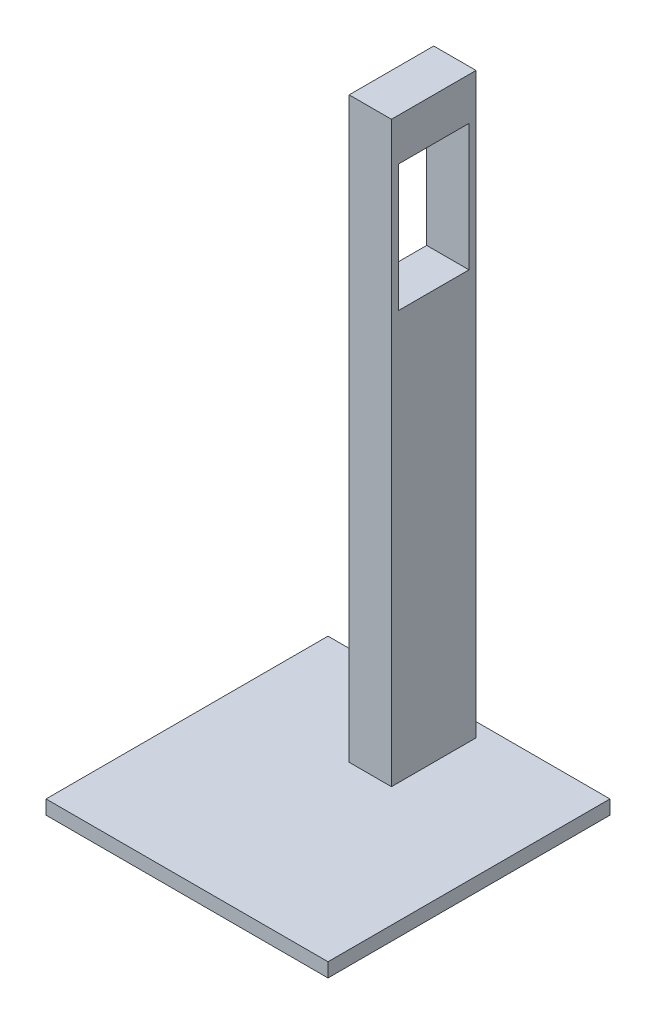
ISO-10303-21;
HEADER;
FILE_DESCRIPTION(('STEP AP214'),'2;1');
FILE_NAME('part.step','',(''),(''),'','','');
FILE_SCHEMA(('AUTOMOTIVE_DESIGN { 1 0 10303 214 1 1 1 1 }'));
ENDSEC;
DATA;
#1=APPLICATION_CONTEXT('core data for automotive mechanical design processes');
#2=APPLICATION_PROTOCOL_DEFINITION('international standard','automotive_design',2000,#1);
#3=PRODUCT_CONTEXT('',#1,'mechanical');
#4=PRODUCT('Part','Part','',(#3));
#5=PRODUCT_RELATED_PRODUCT_CATEGORY('part','',(#4));
#6=PRODUCT_DEFINITION_FORMATION('','',#4);
#7=PRODUCT_DEFINITION_CONTEXT('part definition',#1,'design');
#8=PRODUCT_DEFINITION('design','',#6,#7);
#9=PRODUCT_DEFINITION_SHAPE('','',#8);
#10=(LENGTH_UNIT() NAMED_UNIT(*) SI_UNIT(.MILLI.,.METRE.));
#11=(NAMED_UNIT(*) PLANE_ANGLE_UNIT() SI_UNIT($,.RADIAN.));
#12=(NAMED_UNIT(*) SI_UNIT($,.STERADIAN.) SOLID_ANGLE_UNIT());
#13=UNCERTAINTY_MEASURE_WITH_UNIT(LENGTH_MEASURE(1.E-05),#10,'distance_accuracy_value','');
#14=(GEOMETRIC_REPRESENTATION_CONTEXT(3) GLOBAL_UNCERTAINTY_ASSIGNED_CONTEXT((#13)) GLOBAL_UNIT_ASSIGNED_CONTEXT((#10,
#11,#12)) REPRESENTATION_CONTEXT('',''));
#15=CARTESIAN_POINT('',(0.,0.,0.));
#16=DIRECTION('',(0.,0.,1.));
#17=DIRECTION('',(1.,0.,0.));
#18=AXIS2_PLACEMENT_3D('',#15,#16,#17);
#19=CARTESIAN_POINT('',(0.,2.54,0.));
#20=DIRECTION('',(0.,-1.,0.));
#21=DIRECTION('',(0.,0.,-1.));
#22=AXIS2_PLACEMENT_3D('',#19,#20,#21);
#23=PLANE('',#22);
#24=DIRECTION('',(0.,0.,-1.));
#25=VECTOR('',#24,1.);
#26=CARTESIAN_POINT('',(25.4,2.54,25.4));
#27=LINE('',#26,#25);
#28=CARTESIAN_POINT('',(25.4,2.54,25.4));
#29=VERTEX_POINT('',#28);
#30=CARTESIAN_POINT('',(25.4,2.54,-25.4));
#31=VERTEX_POINT('',#30);
#32=EDGE_CURVE('E195',#29,#31,#27,.T.);
#33=ORIENTED_EDGE('',*,*,#32,.T.);
#34=DIRECTION('',(-1.,0.,0.));
#35=VECTOR('',#34,1.);
#36=CARTESIAN_POINT('',(-25.4,2.54,-25.4));
#37=LINE('',#36,#35);
#38=CARTESIAN_POINT('',(-25.4,2.54,-25.4));
#39=VERTEX_POINT('',#38);
#40=EDGE_CURVE('E198',#31,#39,#37,.T.);
#41=ORIENTED_EDGE('',*,*,#40,.T.);
#42=DIRECTION('',(0.,0.,1.));
#43=VECTOR('',#42,1.);
#44=CARTESIAN_POINT('',(-25.4,2.54,25.4));
#45=LINE('',#44,#43);
#46=CARTESIAN_POINT('',(-25.4,2.54,25.4));
#47=VERTEX_POINT('',#46);
#48=EDGE_CURVE('E201',#39,#47,#45,.T.);
#49=ORIENTED_EDGE('',*,*,#48,.T.);
#50=DIRECTION('',(1.,0.,0.));
#51=VECTOR('',#50,1.);
#52=CARTESIAN_POINT('',(-25.4,2.54,25.4));
#53=LINE('',#52,#51);
#54=EDGE_CURVE('E203',#47,#29,#53,.T.);
#55=ORIENTED_EDGE('',*,*,#54,.T.);
#56=EDGE_LOOP('',(#33,#41,#49,#55));
#57=FACE_BOUND('',#56,.T.);
#58=DIRECTION('',(0.,0.,-1.));
#59=VECTOR('',#58,1.);
#60=CARTESIAN_POINT('',(3.81,2.54,-22.86));
#61=LINE('',#60,#59);
#62=CARTESIAN_POINT('',(3.81,2.54,-7.62));
#63=VERTEX_POINT('',#62);
#64=CARTESIAN_POINT('',(3.81,2.54,-22.86));
#65=VERTEX_POINT('',#64);
#66=EDGE_CURVE('E161',#63,#65,#61,.T.);
#67=ORIENTED_EDGE('',*,*,#66,.F.);
#68=DIRECTION('',(1.,0.,0.));
#69=VECTOR('',#68,1.);
#70=CARTESIAN_POINT('',(-3.81,2.54,-7.62));
#71=LINE('',#70,#69);
#72=CARTESIAN_POINT('',(-3.81,2.54,-7.62));
#73=VERTEX_POINT('',#72);
#74=EDGE_CURVE('E166',#73,#63,#71,.T.);
#75=ORIENTED_EDGE('',*,*,#74,.F.);
#76=DIRECTION('',(0.,0.,1.));
#77=VECTOR('',#76,1.);
#78=CARTESIAN_POINT('',(-3.81,2.54,-22.86));
#79=LINE('',#78,#77);
#80=CARTESIAN_POINT('',(-3.81,2.54,-22.86));
#81=VERTEX_POINT('',#80);
#82=EDGE_CURVE('E178',#81,#73,#79,.T.);
#83=ORIENTED_EDGE('',*,*,#82,.F.);
#84=DIRECTION('',(-1.,0.,0.));
#85=VECTOR('',#84,1.);
#86=CARTESIAN_POINT('',(-3.81,2.54,-22.86));
#87=LINE('',#86,#85);
#88=EDGE_CURVE('E175',#65,#81,#87,.T.);
#89=ORIENTED_EDGE('',*,*,#88,.F.);
#90=EDGE_LOOP('',(#67,#75,#83,#89));
#91=FACE_BOUND('',#90,.T.);
#92=ADVANCED_FACE('F35',(#57,#91),#23,.F.);
#93=CARTESIAN_POINT('',(25.4,2.54,25.4));
#94=DIRECTION('',(-1.,0.,0.));
#95=DIRECTION('',(0.,0.,1.));
#96=AXIS2_PLACEMENT_3D('',#93,#94,#95);
#97=PLANE('',#96);
#98=DIRECTION('',(0.,0.,-1.));
#99=VECTOR('',#98,1.);
#100=CARTESIAN_POINT('',(25.4,0.,25.4));
#101=LINE('',#100,#99);
#102=CARTESIAN_POINT('',(25.4,0.,25.4));
#103=VERTEX_POINT('',#102);
#104=CARTESIAN_POINT('',(25.4,0.,-25.4));
#105=VERTEX_POINT('',#104);
#106=EDGE_CURVE('E194',#103,#105,#101,.T.);
#107=ORIENTED_EDGE('',*,*,#106,.T.);
#108=DIRECTION('',(0.,-1.,0.));
#109=VECTOR('',#108,1.);
#110=CARTESIAN_POINT('',(25.4,2.54,-25.4));
#111=LINE('',#110,#109);
#112=EDGE_CURVE('E11',#31,#105,#111,.T.);
#113=ORIENTED_EDGE('',*,*,#112,.F.);
#114=ORIENTED_EDGE('',*,*,#32,.F.);
#115=DIRECTION('',(0.,-1.,0.));
#116=VECTOR('',#115,1.);
#117=CARTESIAN_POINT('',(25.4,2.54,25.4));
#118=LINE('',#117,#116);
#119=EDGE_CURVE('E205',#29,#103,#118,.T.);
#120=ORIENTED_EDGE('',*,*,#119,.T.);
#121=EDGE_LOOP('',(#107,#113,#114,#120));
#122=FACE_BOUND('',#121,.T.);
#123=ADVANCED_FACE('F37',(#122),#97,.F.);
#124=CARTESIAN_POINT('',(-25.4,2.54,-25.4));
#125=DIRECTION('',(0.,0.,1.));
#126=DIRECTION('',(1.,0.,0.));
#127=AXIS2_PLACEMENT_3D('',#124,#125,#126);
#128=PLANE('',#127);
#129=DIRECTION('',(-1.,0.,0.));
#130=VECTOR('',#129,1.);
#131=CARTESIAN_POINT('',(-25.4,0.,-25.4));
#132=LINE('',#131,#130);
#133=CARTESIAN_POINT('',(-25.4,0.,-25.4));
#134=VERTEX_POINT('',#133);
#135=EDGE_CURVE('E208',#105,#134,#132,.T.);
#136=ORIENTED_EDGE('',*,*,#135,.T.);
#137=DIRECTION('',(0.,-1.,0.));
#138=VECTOR('',#137,1.);
#139=CARTESIAN_POINT('',(-25.4,2.54,-25.4));
#140=LINE('',#139,#138);
#141=EDGE_CURVE('E43',#39,#134,#140,.T.);
#142=ORIENTED_EDGE('',*,*,#141,.F.);
#143=ORIENTED_EDGE('',*,*,#40,.F.);
#144=ORIENTED_EDGE('',*,*,#112,.T.);
#145=EDGE_LOOP('',(#136,#142,#143,#144));
#146=FACE_BOUND('',#145,.T.);
#147=ADVANCED_FACE('F238',(#146),#128,.F.);
#148=CARTESIAN_POINT('',(-25.4,2.54,25.4));
#149=DIRECTION('',(1.,0.,0.));
#150=DIRECTION('',(0.,0.,-1.));
#151=AXIS2_PLACEMENT_3D('',#148,#149,#150);
#152=PLANE('',#151);
#153=DIRECTION('',(0.,0.,1.));
#154=VECTOR('',#153,1.);
#155=CARTESIAN_POINT('',(-25.4,0.,25.4));
#156=LINE('',#155,#154);
#157=CARTESIAN_POINT('',(-25.4,0.,25.4));
#158=VERTEX_POINT('',#157);
#159=EDGE_CURVE('E210',#134,#158,#156,.T.);
#160=ORIENTED_EDGE('',*,*,#159,.T.);
#161=DIRECTION('',(0.,-1.,0.));
#162=VECTOR('',#161,1.);
#163=CARTESIAN_POINT('',(-25.4,2.54,25.4));
#164=LINE('',#163,#162);
#165=EDGE_CURVE('E215',#47,#158,#164,.T.);
#166=ORIENTED_EDGE('',*,*,#165,.F.);
#167=ORIENTED_EDGE('',*,*,#48,.F.);
#168=ORIENTED_EDGE('',*,*,#141,.T.);
#169=EDGE_LOOP('',(#160,#166,#167,#168));
#170=FACE_BOUND('',#169,.T.);
#171=ADVANCED_FACE('F222',(#170),#152,.F.);
#172=CARTESIAN_POINT('',(-25.4,2.54,25.4));
#173=DIRECTION('',(0.,0.,-1.));
#174=DIRECTION('',(-1.,0.,0.));
#175=AXIS2_PLACEMENT_3D('',#172,#173,#174);
#176=PLANE('',#175);
#177=DIRECTION('',(1.,0.,0.));
#178=VECTOR('',#177,1.);
#179=CARTESIAN_POINT('',(-25.4,0.,25.4));
#180=LINE('',#179,#178);
#181=EDGE_CURVE('E199',#158,#103,#180,.T.);
#182=ORIENTED_EDGE('',*,*,#181,.T.);
#183=ORIENTED_EDGE('',*,*,#119,.F.);
#184=ORIENTED_EDGE('',*,*,#54,.F.);
#185=ORIENTED_EDGE('',*,*,#165,.T.);
#186=EDGE_LOOP('',(#182,#183,#184,#185));
#187=FACE_BOUND('',#186,.T.);
#188=ADVANCED_FACE('F231',(#187),#176,.F.);
#189=CARTESIAN_POINT('',(0.,0.,0.));
#190=DIRECTION('',(0.,-1.,0.));
#191=DIRECTION('',(0.,0.,-1.));
#192=AXIS2_PLACEMENT_3D('',#189,#190,#191);
#193=PLANE('',#192);
#194=ORIENTED_EDGE('',*,*,#106,.F.);
#195=ORIENTED_EDGE('',*,*,#181,.F.);
#196=ORIENTED_EDGE('',*,*,#159,.F.);
#197=ORIENTED_EDGE('',*,*,#135,.F.);
#198=EDGE_LOOP('',(#194,#195,#196,#197));
#199=FACE_BOUND('',#198,.T.);
#200=ADVANCED_FACE('F228',(#199),#193,.T.);
#201=CARTESIAN_POINT('',(3.81,106.68,-22.86));
#202=DIRECTION('',(-1.,0.,0.));
#203=DIRECTION('',(0.,0.,1.));
#204=AXIS2_PLACEMENT_3D('',#201,#202,#203);
#205=PLANE('',#204);
#206=DIRECTION('',(0.,0.,1.));
#207=VECTOR('',#206,1.);
#208=CARTESIAN_POINT('',(3.81,76.2,-22.86));
#209=LINE('',#208,#207);
#210=CARTESIAN_POINT('',(3.81,76.2,-21.59));
#211=VERTEX_POINT('',#210);
#212=CARTESIAN_POINT('',(3.81,76.2,-8.89));
#213=VERTEX_POINT('',#212);
#214=EDGE_CURVE('E155',#211,#213,#209,.T.);
#215=ORIENTED_EDGE('',*,*,#214,.T.);
#216=DIRECTION('',(0.,1.,0.));
#217=VECTOR('',#216,1.);
#218=CARTESIAN_POINT('',(3.81,106.68,-8.89));
#219=LINE('',#218,#217);
#220=CARTESIAN_POINT('',(3.81,99.06,-8.89));
#221=VERTEX_POINT('',#220);
#222=EDGE_CURVE('E158',#213,#221,#219,.T.);
#223=ORIENTED_EDGE('',*,*,#222,.T.);
#224=DIRECTION('',(0.,0.,-1.));
#225=VECTOR('',#224,1.);
#226=CARTESIAN_POINT('',(3.81,99.06,-22.86));
#227=LINE('',#226,#225);
#228=CARTESIAN_POINT('',(3.81,99.06,-21.59));
#229=VERTEX_POINT('',#228);
#230=EDGE_CURVE('E150',#221,#229,#227,.T.);
#231=ORIENTED_EDGE('',*,*,#230,.T.);
#232=DIRECTION('',(0.,-1.,0.));
#233=VECTOR('',#232,1.);
#234=CARTESIAN_POINT('',(3.81,106.68,-21.59));
#235=LINE('',#234,#233);
#236=EDGE_CURVE('E130',#229,#211,#235,.T.);
#237=ORIENTED_EDGE('',*,*,#236,.T.);
#238=EDGE_LOOP('',(#215,#223,#231,#237));
#239=FACE_BOUND('',#238,.T.);
#240=ORIENTED_EDGE('',*,*,#66,.T.);
#241=DIRECTION('',(0.,-1.,0.));
#242=VECTOR('',#241,1.);
#243=CARTESIAN_POINT('',(3.81,106.68,-22.86));
#244=LINE('',#243,#242);
#245=CARTESIAN_POINT('',(3.81,106.68,-22.86));
#246=VERTEX_POINT('',#245);
#247=EDGE_CURVE('E191',#246,#65,#244,.T.);
#248=ORIENTED_EDGE('',*,*,#247,.F.);
#249=DIRECTION('',(0.,0.,-1.));
#250=VECTOR('',#249,1.);
#251=CARTESIAN_POINT('',(3.81,106.68,-22.86));
#252=LINE('',#251,#250);
#253=CARTESIAN_POINT('',(3.81,106.68,-7.62));
#254=VERTEX_POINT('',#253);
#255=EDGE_CURVE('E162',#254,#246,#252,.T.);
#256=ORIENTED_EDGE('',*,*,#255,.F.);
#257=DIRECTION('',(0.,-1.,0.));
#258=VECTOR('',#257,1.);
#259=CARTESIAN_POINT('',(3.81,106.68,-7.62));
#260=LINE('',#259,#258);
#261=EDGE_CURVE('E172',#254,#63,#260,.T.);
#262=ORIENTED_EDGE('',*,*,#261,.T.);
#263=EDGE_LOOP('',(#240,#248,#256,#262));
#264=FACE_BOUND('',#263,.T.);
#265=ADVANCED_FACE('F251',(#239,#264),#205,.F.);
#266=CARTESIAN_POINT('',(-3.81,106.68,-22.86));
#267=DIRECTION('',(0.,0.,1.));
#268=DIRECTION('',(1.,0.,0.));
#269=AXIS2_PLACEMENT_3D('',#266,#267,#268);
#270=PLANE('',#269);
#271=ORIENTED_EDGE('',*,*,#88,.T.);
#272=DIRECTION('',(0.,-1.,0.));
#273=VECTOR('',#272,1.);
#274=CARTESIAN_POINT('',(-3.81,106.68,-22.86));
#275=LINE('',#274,#273);
#276=CARTESIAN_POINT('',(-3.81,106.68,-22.86));
#277=VERTEX_POINT('',#276);
#278=EDGE_CURVE('E188',#277,#81,#275,.T.);
#279=ORIENTED_EDGE('',*,*,#278,.F.);
#280=DIRECTION('',(-1.,0.,0.));
#281=VECTOR('',#280,1.);
#282=CARTESIAN_POINT('',(-3.81,106.68,-22.86));
#283=LINE('',#282,#281);
#284=EDGE_CURVE('E165',#246,#277,#283,.T.);
#285=ORIENTED_EDGE('',*,*,#284,.F.);
#286=ORIENTED_EDGE('',*,*,#247,.T.);
#287=EDGE_LOOP('',(#271,#279,#285,#286));
#288=FACE_BOUND('',#287,.T.);
#289=ADVANCED_FACE('F270',(#288),#270,.F.);
#290=CARTESIAN_POINT('',(-3.81,106.68,-22.86));
#291=DIRECTION('',(1.,0.,0.));
#292=DIRECTION('',(0.,0.,-1.));
#293=AXIS2_PLACEMENT_3D('',#290,#291,#292);
#294=PLANE('',#293);
#295=DIRECTION('',(0.,0.,-1.));
#296=VECTOR('',#295,1.);
#297=CARTESIAN_POINT('',(-3.81,99.06,-21.59));
#298=LINE('',#297,#296);
#299=CARTESIAN_POINT('',(-3.81,99.06,-8.89));
#300=VERTEX_POINT('',#299);
#301=CARTESIAN_POINT('',(-3.81,99.06,-21.59));
#302=VERTEX_POINT('',#301);
#303=EDGE_CURVE('E136',#300,#302,#298,.T.);
#304=ORIENTED_EDGE('',*,*,#303,.F.);
#305=DIRECTION('',(0.,1.,0.));
#306=VECTOR('',#305,1.);
#307=CARTESIAN_POINT('',(-3.81,76.2,-8.89));
#308=LINE('',#307,#306);
#309=CARTESIAN_POINT('',(-3.81,76.2,-8.89));
#310=VERTEX_POINT('',#309);
#311=EDGE_CURVE('E58',#310,#300,#308,.T.);
#312=ORIENTED_EDGE('',*,*,#311,.F.);
#313=DIRECTION('',(0.,0.,1.));
#314=VECTOR('',#313,1.);
#315=CARTESIAN_POINT('',(-3.81,76.2,-21.59));
#316=LINE('',#315,#314);
#317=CARTESIAN_POINT('',(-3.81,76.2,-21.59));
#318=VERTEX_POINT('',#317);
#319=EDGE_CURVE('E143',#318,#310,#316,.T.);
#320=ORIENTED_EDGE('',*,*,#319,.F.);
#321=DIRECTION('',(0.,-1.,0.));
#322=VECTOR('',#321,1.);
#323=CARTESIAN_POINT('',(-3.81,76.2,-21.59));
#324=LINE('',#323,#322);
#325=EDGE_CURVE('E127',#302,#318,#324,.T.);
#326=ORIENTED_EDGE('',*,*,#325,.F.);
#327=EDGE_LOOP('',(#304,#312,#320,#326));
#328=FACE_BOUND('',#327,.T.);
#329=ORIENTED_EDGE('',*,*,#82,.T.);
#330=DIRECTION('',(0.,-1.,0.));
#331=VECTOR('',#330,1.);
#332=CARTESIAN_POINT('',(-3.81,106.68,-7.62));
#333=LINE('',#332,#331);
#334=CARTESIAN_POINT('',(-3.81,106.68,-7.62));
#335=VERTEX_POINT('',#334);
#336=EDGE_CURVE('E185',#335,#73,#333,.T.);
#337=ORIENTED_EDGE('',*,*,#336,.F.);
#338=DIRECTION('',(0.,0.,1.));
#339=VECTOR('',#338,1.);
#340=CARTESIAN_POINT('',(-3.81,106.68,-22.86));
#341=LINE('',#340,#339);
#342=EDGE_CURVE('E168',#277,#335,#341,.T.);
#343=ORIENTED_EDGE('',*,*,#342,.F.);
#344=ORIENTED_EDGE('',*,*,#278,.T.);
#345=EDGE_LOOP('',(#329,#337,#343,#344));
#346=FACE_BOUND('',#345,.T.);
#347=ADVANCED_FACE('F140',(#328,#346),#294,.F.);
#348=CARTESIAN_POINT('',(-3.81,106.68,-7.62));
#349=DIRECTION('',(0.,0.,-1.));
#350=DIRECTION('',(-1.,0.,0.));
#351=AXIS2_PLACEMENT_3D('',#348,#349,#350);
#352=PLANE('',#351);
#353=ORIENTED_EDGE('',*,*,#74,.T.);
#354=ORIENTED_EDGE('',*,*,#261,.F.);
#355=DIRECTION('',(1.,0.,0.));
#356=VECTOR('',#355,1.);
#357=CARTESIAN_POINT('',(-3.81,106.68,-7.62));
#358=LINE('',#357,#356);
#359=EDGE_CURVE('E170',#335,#254,#358,.T.);
#360=ORIENTED_EDGE('',*,*,#359,.F.);
#361=ORIENTED_EDGE('',*,*,#336,.T.);
#362=EDGE_LOOP('',(#353,#354,#360,#361));
#363=FACE_BOUND('',#362,.T.);
#364=ADVANCED_FACE('F285',(#363),#352,.F.);
#365=CARTESIAN_POINT('',(0.,106.68,0.));
#366=DIRECTION('',(0.,1.,0.));
#367=DIRECTION('',(0.,0.,1.));
#368=AXIS2_PLACEMENT_3D('',#365,#366,#367);
#369=PLANE('',#368);
#370=ORIENTED_EDGE('',*,*,#255,.T.);
#371=ORIENTED_EDGE('',*,*,#284,.T.);
#372=ORIENTED_EDGE('',*,*,#342,.T.);
#373=ORIENTED_EDGE('',*,*,#359,.T.);
#374=EDGE_LOOP('',(#370,#371,#372,#373));
#375=FACE_BOUND('',#374,.T.);
#376=ADVANCED_FACE('F292',(#375),#369,.T.);
#377=CARTESIAN_POINT('',(25.4,76.2,-8.89));
#378=DIRECTION('',(0.,0.,1.));
#379=DIRECTION('',(1.,0.,0.));
#380=AXIS2_PLACEMENT_3D('',#377,#378,#379);
#381=PLANE('',#380);
#382=DIRECTION('',(-1.,0.,0.));
#383=VECTOR('',#382,1.);
#384=CARTESIAN_POINT('',(25.4,76.2,-8.89));
#385=LINE('',#384,#383);
#386=EDGE_CURVE('E148',#213,#310,#385,.T.);
#387=ORIENTED_EDGE('',*,*,#386,.T.);
#388=ORIENTED_EDGE('',*,*,#311,.T.);
#389=DIRECTION('',(-1.,0.,0.));
#390=VECTOR('',#389,1.);
#391=CARTESIAN_POINT('',(25.4,99.06,-8.89));
#392=LINE('',#391,#390);
#393=EDGE_CURVE('E133',#221,#300,#392,.T.);
#394=ORIENTED_EDGE('',*,*,#393,.F.);
#395=ORIENTED_EDGE('',*,*,#222,.F.);
#396=EDGE_LOOP('',(#387,#388,#394,#395));
#397=FACE_BOUND('',#396,.T.);
#398=ADVANCED_FACE('F299',(#397),#381,.F.);
#399=CARTESIAN_POINT('',(25.4,76.2,-21.59));
#400=DIRECTION('',(0.,-1.,0.));
#401=DIRECTION('',(0.,0.,-1.));
#402=AXIS2_PLACEMENT_3D('',#399,#400,#401);
#403=PLANE('',#402);
#404=DIRECTION('',(-1.,0.,0.));
#405=VECTOR('',#404,1.);
#406=CARTESIAN_POINT('',(25.4,76.2,-21.59));
#407=LINE('',#406,#405);
#408=EDGE_CURVE('E132',#211,#318,#407,.T.);
#409=ORIENTED_EDGE('',*,*,#408,.T.);
#410=ORIENTED_EDGE('',*,*,#319,.T.);
#411=ORIENTED_EDGE('',*,*,#386,.F.);
#412=ORIENTED_EDGE('',*,*,#214,.F.);
#413=EDGE_LOOP('',(#409,#410,#411,#412));
#414=FACE_BOUND('',#413,.T.);
#415=ADVANCED_FACE('F306',(#414),#403,.F.);
#416=CARTESIAN_POINT('',(25.4,76.2,-21.59));
#417=DIRECTION('',(0.,0.,-1.));
#418=DIRECTION('',(-1.,0.,0.));
#419=AXIS2_PLACEMENT_3D('',#416,#417,#418);
#420=PLANE('',#419);
#421=DIRECTION('',(-1.,0.,0.));
#422=VECTOR('',#421,1.);
#423=CARTESIAN_POINT('',(25.4,99.06,-21.59));
#424=LINE('',#423,#422);
#425=EDGE_CURVE('E50',#229,#302,#424,.T.);
#426=ORIENTED_EDGE('',*,*,#425,.T.);
#427=ORIENTED_EDGE('',*,*,#325,.T.);
#428=ORIENTED_EDGE('',*,*,#408,.F.);
#429=ORIENTED_EDGE('',*,*,#236,.F.);
#430=EDGE_LOOP('',(#426,#427,#428,#429));
#431=FACE_BOUND('',#430,.T.);
#432=ADVANCED_FACE('F124',(#431),#420,.F.);
#433=CARTESIAN_POINT('',(25.4,99.06,-21.59));
#434=DIRECTION('',(0.,1.,0.));
#435=DIRECTION('',(0.,0.,1.));
#436=AXIS2_PLACEMENT_3D('',#433,#434,#435);
#437=PLANE('',#436);
#438=ORIENTED_EDGE('',*,*,#393,.T.);
#439=ORIENTED_EDGE('',*,*,#303,.T.);
#440=ORIENTED_EDGE('',*,*,#425,.F.);
#441=ORIENTED_EDGE('',*,*,#230,.F.);
#442=EDGE_LOOP('',(#438,#439,#440,#441));
#443=FACE_BOUND('',#442,.T.);
#444=ADVANCED_FACE('F137',(#443),#437,.F.);
#445=CLOSED_SHELL('',(#92,#123,#147,#171,#188,#200,#265,#289,#347,#364,#376,#398,#415,#432,#444));
#446=MANIFOLD_SOLID_BREP('B2',#445);
#447=ADVANCED_BREP_SHAPE_REPRESENTATION('',(#18,#446),#14);
#448=SHAPE_DEFINITION_REPRESENTATION(#9,#447);
ENDSEC;
END-ISO-10303-21;
